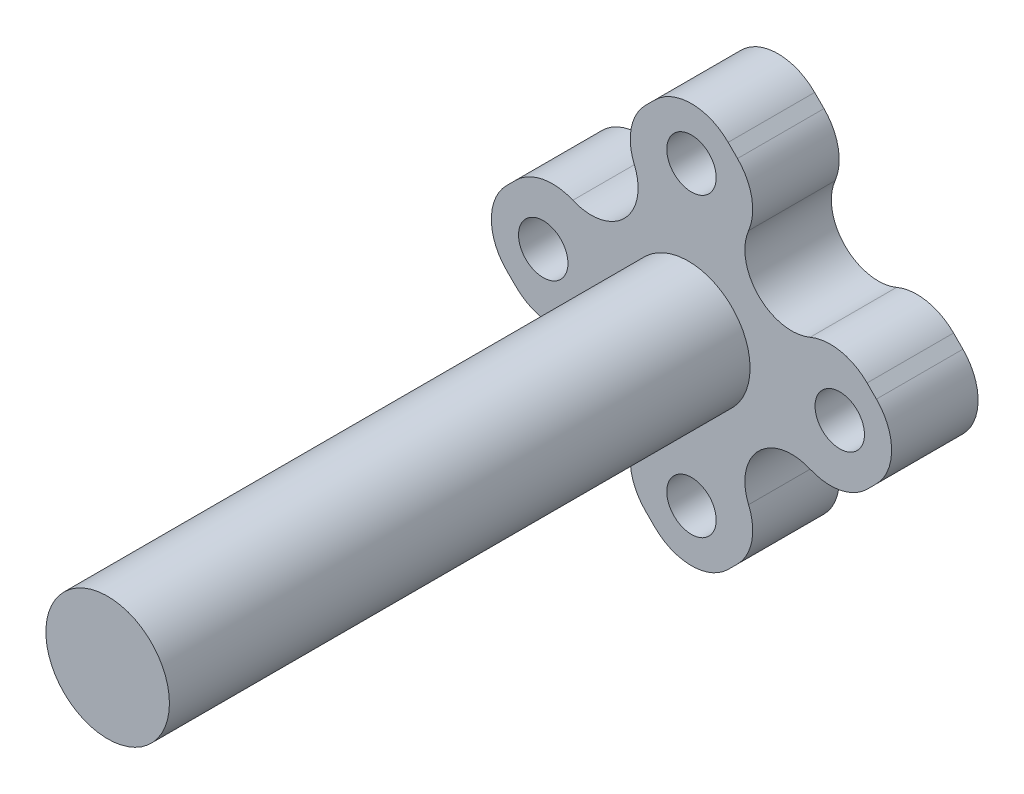
ISO-10303-21;
HEADER;
FILE_DESCRIPTION(('STEP AP214'),'2;1');
FILE_NAME('part.step','',(''),(''),'','','');
FILE_SCHEMA(('AUTOMOTIVE_DESIGN { 1 0 10303 214 1 1 1 1 }'));
ENDSEC;
DATA;
#1=APPLICATION_CONTEXT('core data for automotive mechanical design processes');
#2=APPLICATION_PROTOCOL_DEFINITION('international standard','automotive_design',2000,#1);
#3=PRODUCT_CONTEXT('',#1,'mechanical');
#4=PRODUCT('Part','Part','',(#3));
#5=PRODUCT_RELATED_PRODUCT_CATEGORY('part','',(#4));
#6=PRODUCT_DEFINITION_FORMATION('','',#4);
#7=PRODUCT_DEFINITION_CONTEXT('part definition',#1,'design');
#8=PRODUCT_DEFINITION('design','',#6,#7);
#9=PRODUCT_DEFINITION_SHAPE('','',#8);
#10=(LENGTH_UNIT() NAMED_UNIT(*) SI_UNIT(.MILLI.,.METRE.));
#11=(NAMED_UNIT(*) PLANE_ANGLE_UNIT() SI_UNIT($,.RADIAN.));
#12=(NAMED_UNIT(*) SI_UNIT($,.STERADIAN.) SOLID_ANGLE_UNIT());
#13=UNCERTAINTY_MEASURE_WITH_UNIT(LENGTH_MEASURE(1.E-05),#10,'distance_accuracy_value','');
#14=(GEOMETRIC_REPRESENTATION_CONTEXT(3) GLOBAL_UNCERTAINTY_ASSIGNED_CONTEXT((#13)) GLOBAL_UNIT_ASSIGNED_CONTEXT((#10,
#11,#12)) REPRESENTATION_CONTEXT('',''));
#15=CARTESIAN_POINT('',(0.,0.,0.));
#16=DIRECTION('',(0.,0.,1.));
#17=DIRECTION('',(1.,0.,0.));
#18=AXIS2_PLACEMENT_3D('',#15,#16,#17);
#19=CARTESIAN_POINT('',(0.128862133868904,5.9822875542488,3.5));
#20=DIRECTION('',(0.,0.,1.));
#21=DIRECTION('',(1.,0.,0.));
#22=AXIS2_PLACEMENT_3D('',#19,#20,#21);
#23=PLANE('',#22);
#24=CARTESIAN_POINT('',(0.,0.,3.5));
#25=DIRECTION('',(0.,0.,1.));
#26=DIRECTION('',(1.,0.,0.));
#27=AXIS2_PLACEMENT_3D('',#24,#25,#26);
#28=CIRCLE('',#27,2.5);
#29=CARTESIAN_POINT('',(2.5,0.,3.5));
#30=VERTEX_POINT('',#29);
#31=EDGE_CURVE('E526',#30,#30,#28,.T.);
#32=ORIENTED_EDGE('',*,*,#31,.F.);
#33=EDGE_LOOP('',(#32));
#34=FACE_BOUND('',#33,.T.);
#35=CARTESIAN_POINT('',(6.12886213386876,-0.0177124457511613,3.5));
#36=DIRECTION('',(0.,0.,1.));
#37=DIRECTION('',(1.,0.,0.));
#38=AXIS2_PLACEMENT_3D('',#35,#36,#37);
#39=CIRCLE('',#38,0.99999999999999);
#40=CARTESIAN_POINT('',(7.12886213386875,-0.0177124457511613,3.5));
#41=VERTEX_POINT('',#40);
#42=EDGE_CURVE('E540',#41,#41,#39,.T.);
#43=ORIENTED_EDGE('',*,*,#42,.F.);
#44=EDGE_LOOP('',(#43));
#45=FACE_BOUND('',#44,.T.);
#46=CARTESIAN_POINT('',(0.128862133868531,5.98228755424907,3.5));
#47=DIRECTION('',(0.,0.,1.));
#48=DIRECTION('',(1.,0.,0.));
#49=AXIS2_PLACEMENT_3D('',#46,#47,#48);
#50=CIRCLE('',#49,0.99999999999993);
#51=CARTESIAN_POINT('',(1.12886213386846,5.98228755424907,3.5));
#52=VERTEX_POINT('',#51);
#53=EDGE_CURVE('E242',#52,#52,#50,.T.);
#54=ORIENTED_EDGE('',*,*,#53,.F.);
#55=EDGE_LOOP('',(#54));
#56=FACE_BOUND('',#55,.T.);
#57=CARTESIAN_POINT('',(0.128862133868904,5.9822875542488,3.5));
#58=DIRECTION('',(0.,0.,1.));
#59=DIRECTION('',(1.,0.,0.));
#60=AXIS2_PLACEMENT_3D('',#57,#58,#59);
#61=CIRCLE('',#60,2.10000000000017);
#62=CARTESIAN_POINT('',(1.61378637436093,7.46721179474051,3.5));
#63=VERTEX_POINT('',#62);
#64=CARTESIAN_POINT('',(-1.35606210662298,7.46721179474065,3.5));
#65=VERTEX_POINT('',#64);
#66=EDGE_CURVE('E312',#63,#65,#61,.T.);
#67=ORIENTED_EDGE('',*,*,#66,.T.);
#68=DIRECTION('',(-0.707106781186547,-0.707106781186548,0.));
#69=VECTOR('',#68,1.);
#70=CARTESIAN_POINT('',(-1.73403998619732,7.08923391516631,3.5));
#71=LINE('',#70,#69);
#72=CARTESIAN_POINT('',(-1.73403998619732,7.08923391516631,3.5));
#73=VERTEX_POINT('',#72);
#74=EDGE_CURVE('E147',#65,#73,#71,.T.);
#75=ORIENTED_EDGE('',*,*,#74,.T.);
#76=CARTESIAN_POINT('',(-0.249115745705739,5.60430967467439,3.5));
#77=DIRECTION('',(0.,0.,1.));
#78=DIRECTION('',(1.,0.,0.));
#79=AXIS2_PLACEMENT_3D('',#76,#77,#78);
#80=CIRCLE('',#79,2.1);
#81=CARTESIAN_POINT('',(-2.18252394911343,4.78459465163537,3.5));
#82=VERTEX_POINT('',#81);
#83=EDGE_CURVE('E397',#73,#82,#80,.T.);
#84=ORIENTED_EDGE('',*,*,#83,.T.);
#85=CARTESIAN_POINT('',(-3.93179803791084,4.0429477260283,3.5));
#86=DIRECTION('',(0.,0.,-1.));
#87=DIRECTION('',(1.,0.,0.));
#88=AXIS2_PLACEMENT_3D('',#85,#86,#87);
#89=CIRCLE('',#88,1.90000000000012);
#90=CARTESIAN_POINT('',(-4.67344496351814,2.29367363723104,3.5));
#91=VERTEX_POINT('',#90);
#92=EDGE_CURVE('E416',#82,#91,#89,.T.);
#93=ORIENTED_EDGE('',*,*,#92,.T.);
#94=CARTESIAN_POINT('',(-5.49315998655736,0.360265433823407,3.5));
#95=DIRECTION('',(0.,0.,1.));
#96=DIRECTION('',(1.,0.,0.));
#97=AXIS2_PLACEMENT_3D('',#94,#95,#96);
#98=CIRCLE('',#97,2.10000000000002);
#99=CARTESIAN_POINT('',(-6.97808422704921,1.84518967431506,3.5));
#100=VERTEX_POINT('',#99);
#101=EDGE_CURVE('E412',#91,#100,#98,.T.);
#102=ORIENTED_EDGE('',*,*,#101,.T.);
#103=DIRECTION('',(-0.70710678118655,-0.707106781186545,0.));
#104=VECTOR('',#103,1.);
#105=CARTESIAN_POINT('',(-7.35606210662355,1.46721179474072,3.5));
#106=LINE('',#105,#104);
#107=CARTESIAN_POINT('',(-7.35606210662355,1.46721179474072,3.5));
#108=VERTEX_POINT('',#107);
#109=EDGE_CURVE('E415',#100,#108,#106,.T.);
#110=ORIENTED_EDGE('',*,*,#109,.T.);
#111=CARTESIAN_POINT('',(-5.8711378661317,-0.0177124457511587,3.5));
#112=DIRECTION('',(0.,0.,1.));
#113=DIRECTION('',(1.,0.,0.));
#114=AXIS2_PLACEMENT_3D('',#111,#112,#113);
#115=CIRCLE('',#114,2.10000000000016);
#116=CARTESIAN_POINT('',(-7.35606210662344,-1.50263668624315,3.5));
#117=VERTEX_POINT('',#116);
#118=EDGE_CURVE('E420',#108,#117,#115,.T.);
#119=ORIENTED_EDGE('',*,*,#118,.T.);
#120=DIRECTION('',(0.707106781186545,-0.70710678118655,0.));
#121=VECTOR('',#120,1.);
#122=CARTESIAN_POINT('',(-6.9780842270488,-1.88061456581779,3.5));
#123=LINE('',#122,#121);
#124=CARTESIAN_POINT('',(-6.9780842270488,-1.88061456581779,3.5));
#125=VERTEX_POINT('',#124);
#126=EDGE_CURVE('E427',#117,#125,#123,.T.);
#127=ORIENTED_EDGE('',*,*,#126,.T.);
#128=CARTESIAN_POINT('',(-5.49315998655705,-0.395690325326044,3.5));
#129=DIRECTION('',(0.,0.,1.));
#130=DIRECTION('',(1.,0.,0.));
#131=AXIS2_PLACEMENT_3D('',#128,#129,#130);
#132=CIRCLE('',#131,2.1);
#133=CARTESIAN_POINT('',(-4.67344496351796,-2.3290985287337,3.5));
#134=VERTEX_POINT('',#133);
#135=EDGE_CURVE('E430',#125,#134,#132,.T.);
#136=ORIENTED_EDGE('',*,*,#135,.T.);
#137=CARTESIAN_POINT('',(-3.93179803791116,-4.07837261753111,3.5));
#138=DIRECTION('',(0.,0.,-1.));
#139=DIRECTION('',(1.,0.,0.));
#140=AXIS2_PLACEMENT_3D('',#137,#138,#139);
#141=CIRCLE('',#140,1.9);
#142=CARTESIAN_POINT('',(-2.18252394911376,-4.8200195431379,3.5));
#143=VERTEX_POINT('',#142);
#144=EDGE_CURVE('E433',#134,#143,#141,.T.);
#145=ORIENTED_EDGE('',*,*,#144,.T.);
#146=CARTESIAN_POINT('',(-0.249115745706102,-5.63973456617699,3.5));
#147=DIRECTION('',(0.,0.,1.));
#148=DIRECTION('',(1.,0.,0.));
#149=AXIS2_PLACEMENT_3D('',#146,#147,#148);
#150=CIRCLE('',#149,2.1);
#151=CARTESIAN_POINT('',(-1.73403998619785,-7.12465880666874,3.5));
#152=VERTEX_POINT('',#151);
#153=EDGE_CURVE('E436',#143,#152,#150,.T.);
#154=ORIENTED_EDGE('',*,*,#153,.T.);
#155=DIRECTION('',(0.707106781186542,-0.707106781186553,0.));
#156=VECTOR('',#155,1.);
#157=CARTESIAN_POINT('',(-1.35606210662347,-7.50263668624313,3.5));
#158=LINE('',#157,#156);
#159=CARTESIAN_POINT('',(-1.35606210662347,-7.50263668624313,3.5));
#160=VERTEX_POINT('',#159);
#161=EDGE_CURVE('E439',#152,#160,#158,.T.);
#162=ORIENTED_EDGE('',*,*,#161,.T.);
#163=CARTESIAN_POINT('',(0.128862133868298,-6.0177124457514,3.5));
#164=DIRECTION('',(0.,0.,1.));
#165=DIRECTION('',(1.,0.,0.));
#166=AXIS2_PLACEMENT_3D('',#163,#164,#165);
#167=CIRCLE('',#166,2.1);
#168=CARTESIAN_POINT('',(1.61378637436005,-7.50263668624315,3.5));
#169=VERTEX_POINT('',#168);
#170=EDGE_CURVE('E442',#160,#169,#167,.T.);
#171=ORIENTED_EDGE('',*,*,#170,.T.);
#172=DIRECTION('',(0.707106781186551,0.707106781186544,0.));
#173=VECTOR('',#172,1.);
#174=CARTESIAN_POINT('',(1.99176425393481,-7.12465880666839,3.5));
#175=LINE('',#174,#173);
#176=CARTESIAN_POINT('',(1.99176425393481,-7.12465880666839,3.5));
#177=VERTEX_POINT('',#176);
#178=EDGE_CURVE('E445',#169,#177,#175,.T.);
#179=ORIENTED_EDGE('',*,*,#178,.T.);
#180=CARTESIAN_POINT('',(0.506840013443062,-5.63973456617663,3.5));
#181=DIRECTION('',(0.,0.,1.));
#182=DIRECTION('',(1.,0.,0.));
#183=AXIS2_PLACEMENT_3D('',#180,#181,#182);
#184=CIRCLE('',#183,2.1);
#185=CARTESIAN_POINT('',(2.44024821685072,-4.82001954313754,3.5));
#186=VERTEX_POINT('',#185);
#187=EDGE_CURVE('E448',#177,#186,#184,.T.);
#188=ORIENTED_EDGE('',*,*,#187,.T.);
#189=CARTESIAN_POINT('',(4.18952230564812,-4.07837261753075,3.5));
#190=DIRECTION('',(0.,0.,-1.));
#191=DIRECTION('',(1.,0.,0.));
#192=AXIS2_PLACEMENT_3D('',#189,#190,#191);
#193=CIRCLE('',#192,1.9);
#194=CARTESIAN_POINT('',(4.93116923125491,-2.32909852873334,3.5));
#195=VERTEX_POINT('',#194);
#196=EDGE_CURVE('E451',#186,#195,#193,.T.);
#197=ORIENTED_EDGE('',*,*,#196,.T.);
#198=CARTESIAN_POINT('',(5.75088425429401,-0.395690325325688,3.5));
#199=DIRECTION('',(0.,0.,1.));
#200=DIRECTION('',(1.,0.,0.));
#201=AXIS2_PLACEMENT_3D('',#198,#199,#200);
#202=CIRCLE('',#201,2.1);
#203=CARTESIAN_POINT('',(7.23580849478576,-1.88061456581744,3.5));
#204=VERTEX_POINT('',#203);
#205=EDGE_CURVE('E454',#195,#204,#202,.T.);
#206=ORIENTED_EDGE('',*,*,#205,.T.);
#207=DIRECTION('',(0.707106781186549,0.707106781186546,0.));
#208=VECTOR('',#207,1.);
#209=CARTESIAN_POINT('',(7.61378637436052,-1.50263668624268,3.5));
#210=LINE('',#209,#208);
#211=CARTESIAN_POINT('',(7.61378637436052,-1.50263668624268,3.5));
#212=VERTEX_POINT('',#211);
#213=EDGE_CURVE('E457',#204,#212,#210,.T.);
#214=ORIENTED_EDGE('',*,*,#213,.T.);
#215=CARTESIAN_POINT('',(6.12886213386918,-0.0177124457505208,3.5));
#216=DIRECTION('',(0.,0.,1.));
#217=DIRECTION('',(1.,0.,0.));
#218=AXIS2_PLACEMENT_3D('',#215,#216,#217);
#219=CIRCLE('',#218,2.1);
#220=CARTESIAN_POINT('',(7.61378637436092,1.46721179474053,3.5));
#221=VERTEX_POINT('',#220);
#222=EDGE_CURVE('E460',#212,#221,#219,.T.);
#223=ORIENTED_EDGE('',*,*,#222,.T.);
#224=DIRECTION('',(-0.707106781186548,0.707106781186547,0.));
#225=VECTOR('',#224,1.);
#226=CARTESIAN_POINT('',(7.23580849478653,1.84518967431492,3.5));
#227=LINE('',#226,#225);
#228=CARTESIAN_POINT('',(7.23580849478653,1.84518967431492,3.5));
#229=VERTEX_POINT('',#228);
#230=EDGE_CURVE('E463',#221,#229,#227,.T.);
#231=ORIENTED_EDGE('',*,*,#230,.T.);
#232=CARTESIAN_POINT('',(5.75088425429478,0.360265433823168,3.5));
#233=DIRECTION('',(0.,0.,1.));
#234=DIRECTION('',(1.,0.,0.));
#235=AXIS2_PLACEMENT_3D('',#232,#233,#234);
#236=CIRCLE('',#235,2.1);
#237=CARTESIAN_POINT('',(4.93116923125569,2.29367363723082,3.5));
#238=VERTEX_POINT('',#237);
#239=EDGE_CURVE('E214',#229,#238,#236,.T.);
#240=ORIENTED_EDGE('',*,*,#239,.T.);
#241=CARTESIAN_POINT('',(4.18952230564889,4.04294772602823,3.5));
#242=DIRECTION('',(0.,0.,-1.));
#243=DIRECTION('',(1.,0.,0.));
#244=AXIS2_PLACEMENT_3D('',#241,#242,#243);
#245=CIRCLE('',#244,1.9);
#246=CARTESIAN_POINT('',(2.44024821685149,4.78459465163502,3.5));
#247=VERTEX_POINT('',#246);
#248=EDGE_CURVE('E208',#238,#247,#245,.T.);
#249=ORIENTED_EDGE('',*,*,#248,.T.);
#250=CARTESIAN_POINT('',(0.506840013443829,5.60430967467411,3.5));
#251=DIRECTION('',(0.,0.,1.));
#252=DIRECTION('',(1.,0.,0.));
#253=AXIS2_PLACEMENT_3D('',#250,#251,#252);
#254=CIRCLE('',#253,2.1);
#255=CARTESIAN_POINT('',(1.99176425393558,7.08923391516586,3.5));
#256=VERTEX_POINT('',#255);
#257=EDGE_CURVE('E212',#247,#256,#254,.T.);
#258=ORIENTED_EDGE('',*,*,#257,.T.);
#259=DIRECTION('',(-0.707106781186548,0.707106781186547,0.));
#260=VECTOR('',#259,1.);
#261=CARTESIAN_POINT('',(1.61378637436093,7.46721179474051,3.5));
#262=LINE('',#261,#260);
#263=EDGE_CURVE('E57',#256,#63,#262,.T.);
#264=ORIENTED_EDGE('',*,*,#263,.T.);
#265=EDGE_LOOP('',(#67,#75,#84,#93,#102,#110,#119,#127,#136,#145,#154,#162,#171,#179,#188,#197,
#206,#214,#223,#231,#240,#249,#258,#264));
#266=FACE_BOUND('',#265,.T.);
#267=CARTESIAN_POINT('',(0.128862133868298,-6.0177124457514,3.5));
#268=DIRECTION('',(0.,0.,1.));
#269=DIRECTION('',(1.,0.,0.));
#270=AXIS2_PLACEMENT_3D('',#267,#268,#269);
#271=CIRCLE('',#270,0.999999999999785);
#272=CARTESIAN_POINT('',(1.12886213386808,-6.0177124457514,3.5));
#273=VERTEX_POINT('',#272);
#274=EDGE_CURVE('E548',#273,#273,#271,.T.);
#275=ORIENTED_EDGE('',*,*,#274,.F.);
#276=EDGE_LOOP('',(#275));
#277=FACE_BOUND('',#276,.T.);
#278=CARTESIAN_POINT('',(-5.8711378661317,-0.0177124457511587,3.5));
#279=DIRECTION('',(0.,0.,1.));
#280=DIRECTION('',(1.,0.,0.));
#281=AXIS2_PLACEMENT_3D('',#278,#279,#280);
#282=CIRCLE('',#281,0.99999999999995);
#283=CARTESIAN_POINT('',(-4.87113786613175,-0.0177124457511587,3.5));
#284=VERTEX_POINT('',#283);
#285=EDGE_CURVE('E531',#284,#284,#282,.T.);
#286=ORIENTED_EDGE('',*,*,#285,.F.);
#287=EDGE_LOOP('',(#286));
#288=FACE_BOUND('',#287,.T.);
#289=ADVANCED_FACE('F39',(#34,#45,#56,#266,#277,#288),#23,.T.);
#290=CARTESIAN_POINT('',(0.128862133868904,5.9822875542488,0.));
#291=DIRECTION('',(0.,0.,1.));
#292=DIRECTION('',(1.,0.,0.));
#293=AXIS2_PLACEMENT_3D('',#290,#291,#292);
#294=PLANE('',#293);
#295=CARTESIAN_POINT('',(0.128862133868904,5.9822875542488,0.));
#296=DIRECTION('',(0.,0.,1.));
#297=DIRECTION('',(1.,0.,0.));
#298=AXIS2_PLACEMENT_3D('',#295,#296,#297);
#299=CIRCLE('',#298,2.10000000000017);
#300=CARTESIAN_POINT('',(1.61378637436093,7.46721179474051,0.));
#301=VERTEX_POINT('',#300);
#302=CARTESIAN_POINT('',(-1.35606210662298,7.46721179474065,0.));
#303=VERTEX_POINT('',#302);
#304=EDGE_CURVE('E237',#301,#303,#299,.T.);
#305=ORIENTED_EDGE('',*,*,#304,.F.);
#306=DIRECTION('',(-0.707106781186548,0.707106781186547,0.));
#307=VECTOR('',#306,1.);
#308=CARTESIAN_POINT('',(1.61378637436093,7.46721179474051,0.));
#309=LINE('',#308,#307);
#310=CARTESIAN_POINT('',(1.99176425393558,7.08923391516586,0.));
#311=VERTEX_POINT('',#310);
#312=EDGE_CURVE('E139',#311,#301,#309,.T.);
#313=ORIENTED_EDGE('',*,*,#312,.F.);
#314=CARTESIAN_POINT('',(0.506840013443828,5.60430967467411,0.));
#315=DIRECTION('',(0.,0.,1.));
#316=DIRECTION('',(1.,0.,0.));
#317=AXIS2_PLACEMENT_3D('',#314,#315,#316);
#318=CIRCLE('',#317,2.1);
#319=CARTESIAN_POINT('',(2.44024821685149,4.78459465163502,0.));
#320=VERTEX_POINT('',#319);
#321=EDGE_CURVE('E133',#320,#311,#318,.T.);
#322=ORIENTED_EDGE('',*,*,#321,.F.);
#323=CARTESIAN_POINT('',(4.18952230564889,4.04294772602823,0.));
#324=DIRECTION('',(0.,0.,-1.));
#325=DIRECTION('',(1.,0.,0.));
#326=AXIS2_PLACEMENT_3D('',#323,#324,#325);
#327=CIRCLE('',#326,1.9);
#328=CARTESIAN_POINT('',(4.93116923125569,2.29367363723082,0.));
#329=VERTEX_POINT('',#328);
#330=EDGE_CURVE('E224',#329,#320,#327,.T.);
#331=ORIENTED_EDGE('',*,*,#330,.F.);
#332=CARTESIAN_POINT('',(5.75088425429478,0.360265433823168,0.));
#333=DIRECTION('',(0.,0.,1.));
#334=DIRECTION('',(1.,0.,0.));
#335=AXIS2_PLACEMENT_3D('',#332,#333,#334);
#336=CIRCLE('',#335,2.1);
#337=CARTESIAN_POINT('',(7.23580849478653,1.84518967431492,0.));
#338=VERTEX_POINT('',#337);
#339=EDGE_CURVE('E303',#338,#329,#336,.T.);
#340=ORIENTED_EDGE('',*,*,#339,.F.);
#341=DIRECTION('',(-0.707106781186548,0.707106781186547,0.));
#342=VECTOR('',#341,1.);
#343=CARTESIAN_POINT('',(7.23580849478653,1.84518967431492,0.));
#344=LINE('',#343,#342);
#345=CARTESIAN_POINT('',(7.61378637436092,1.46721179474053,0.));
#346=VERTEX_POINT('',#345);
#347=EDGE_CURVE('E300',#346,#338,#344,.T.);
#348=ORIENTED_EDGE('',*,*,#347,.F.);
#349=CARTESIAN_POINT('',(6.12886213386918,-0.0177124457512355,0.));
#350=DIRECTION('',(0.,0.,1.));
#351=DIRECTION('',(1.,0.,0.));
#352=AXIS2_PLACEMENT_3D('',#349,#350,#351);
#353=CIRCLE('',#352,2.1);
#354=CARTESIAN_POINT('',(7.61378637436052,-1.50263668624268,0.));
#355=VERTEX_POINT('',#354);
#356=EDGE_CURVE('E297',#355,#346,#353,.T.);
#357=ORIENTED_EDGE('',*,*,#356,.F.);
#358=DIRECTION('',(0.707106781186549,0.707106781186546,0.));
#359=VECTOR('',#358,1.);
#360=CARTESIAN_POINT('',(7.61378637436052,-1.50263668624268,0.));
#361=LINE('',#360,#359);
#362=CARTESIAN_POINT('',(7.23580849478576,-1.88061456581744,0.));
#363=VERTEX_POINT('',#362);
#364=EDGE_CURVE('E293',#363,#355,#361,.T.);
#365=ORIENTED_EDGE('',*,*,#364,.F.);
#366=CARTESIAN_POINT('',(5.75088425429401,-0.395690325325688,0.));
#367=DIRECTION('',(0.,0.,1.));
#368=DIRECTION('',(1.,0.,0.));
#369=AXIS2_PLACEMENT_3D('',#366,#367,#368);
#370=CIRCLE('',#369,2.1);
#371=CARTESIAN_POINT('',(4.93116923125491,-2.32909852873334,0.));
#372=VERTEX_POINT('',#371);
#373=EDGE_CURVE('E290',#372,#363,#370,.T.);
#374=ORIENTED_EDGE('',*,*,#373,.F.);
#375=CARTESIAN_POINT('',(4.18952230564812,-4.07837261753075,0.));
#376=DIRECTION('',(0.,0.,-1.));
#377=DIRECTION('',(1.,0.,0.));
#378=AXIS2_PLACEMENT_3D('',#375,#376,#377);
#379=CIRCLE('',#378,1.9);
#380=CARTESIAN_POINT('',(2.44024821685072,-4.82001954313754,0.));
#381=VERTEX_POINT('',#380);
#382=EDGE_CURVE('E287',#381,#372,#379,.T.);
#383=ORIENTED_EDGE('',*,*,#382,.F.);
#384=CARTESIAN_POINT('',(0.506840013443062,-5.63973456617663,0.));
#385=DIRECTION('',(0.,0.,1.));
#386=DIRECTION('',(1.,0.,0.));
#387=AXIS2_PLACEMENT_3D('',#384,#385,#386);
#388=CIRCLE('',#387,2.1);
#389=CARTESIAN_POINT('',(1.99176425393481,-7.12465880666839,0.));
#390=VERTEX_POINT('',#389);
#391=EDGE_CURVE('E284',#390,#381,#388,.T.);
#392=ORIENTED_EDGE('',*,*,#391,.F.);
#393=DIRECTION('',(0.707106781186551,0.707106781186544,0.));
#394=VECTOR('',#393,1.);
#395=CARTESIAN_POINT('',(1.99176425393481,-7.12465880666839,0.));
#396=LINE('',#395,#394);
#397=CARTESIAN_POINT('',(1.61378637436005,-7.50263668624315,0.));
#398=VERTEX_POINT('',#397);
#399=EDGE_CURVE('E280',#398,#390,#396,.T.);
#400=ORIENTED_EDGE('',*,*,#399,.F.);
#401=CARTESIAN_POINT('',(0.128862133868298,-6.0177124457514,0.));
#402=DIRECTION('',(0.,0.,1.));
#403=DIRECTION('',(1.,0.,0.));
#404=AXIS2_PLACEMENT_3D('',#401,#402,#403);
#405=CIRCLE('',#404,2.1);
#406=CARTESIAN_POINT('',(-1.35606210662347,-7.50263668624313,0.));
#407=VERTEX_POINT('',#406);
#408=EDGE_CURVE('E277',#407,#398,#405,.T.);
#409=ORIENTED_EDGE('',*,*,#408,.F.);
#410=DIRECTION('',(0.707106781186542,-0.707106781186553,0.));
#411=VECTOR('',#410,1.);
#412=CARTESIAN_POINT('',(-1.35606210662347,-7.50263668624313,0.));
#413=LINE('',#412,#411);
#414=CARTESIAN_POINT('',(-1.73403998619785,-7.12465880666874,0.));
#415=VERTEX_POINT('',#414);
#416=EDGE_CURVE('E274',#415,#407,#413,.T.);
#417=ORIENTED_EDGE('',*,*,#416,.F.);
#418=CARTESIAN_POINT('',(-0.249115745706102,-5.63973456617699,0.));
#419=DIRECTION('',(0.,0.,1.));
#420=DIRECTION('',(1.,0.,0.));
#421=AXIS2_PLACEMENT_3D('',#418,#419,#420);
#422=CIRCLE('',#421,2.1);
#423=CARTESIAN_POINT('',(-2.18252394911376,-4.8200195431379,0.));
#424=VERTEX_POINT('',#423);
#425=EDGE_CURVE('E271',#424,#415,#422,.T.);
#426=ORIENTED_EDGE('',*,*,#425,.F.);
#427=CARTESIAN_POINT('',(-3.93179803791116,-4.07837261753111,0.));
#428=DIRECTION('',(0.,0.,-1.));
#429=DIRECTION('',(1.,0.,0.));
#430=AXIS2_PLACEMENT_3D('',#427,#428,#429);
#431=CIRCLE('',#430,1.9);
#432=CARTESIAN_POINT('',(-4.67344496351796,-2.3290985287337,0.));
#433=VERTEX_POINT('',#432);
#434=EDGE_CURVE('E268',#433,#424,#431,.T.);
#435=ORIENTED_EDGE('',*,*,#434,.F.);
#436=CARTESIAN_POINT('',(-5.49315998655705,-0.395690325326044,0.));
#437=DIRECTION('',(0.,0.,1.));
#438=DIRECTION('',(1.,0.,0.));
#439=AXIS2_PLACEMENT_3D('',#436,#437,#438);
#440=CIRCLE('',#439,2.1);
#441=CARTESIAN_POINT('',(-6.9780842270488,-1.88061456581779,0.));
#442=VERTEX_POINT('',#441);
#443=EDGE_CURVE('E264',#442,#433,#440,.T.);
#444=ORIENTED_EDGE('',*,*,#443,.F.);
#445=DIRECTION('',(0.707106781186545,-0.70710678118655,0.));
#446=VECTOR('',#445,1.);
#447=CARTESIAN_POINT('',(-6.9780842270488,-1.88061456581779,0.));
#448=LINE('',#447,#446);
#449=CARTESIAN_POINT('',(-7.35606210662344,-1.50263668624315,0.));
#450=VERTEX_POINT('',#449);
#451=EDGE_CURVE('E261',#450,#442,#448,.T.);
#452=ORIENTED_EDGE('',*,*,#451,.F.);
#453=CARTESIAN_POINT('',(-5.8711378661317,-0.0177124457511587,0.));
#454=DIRECTION('',(0.,0.,1.));
#455=DIRECTION('',(1.,0.,0.));
#456=AXIS2_PLACEMENT_3D('',#453,#454,#455);
#457=CIRCLE('',#456,2.10000000000016);
#458=CARTESIAN_POINT('',(-7.35606210662355,1.46721179474072,0.));
#459=VERTEX_POINT('',#458);
#460=EDGE_CURVE('E258',#459,#450,#457,.T.);
#461=ORIENTED_EDGE('',*,*,#460,.F.);
#462=DIRECTION('',(-0.70710678118655,-0.707106781186545,0.));
#463=VECTOR('',#462,1.);
#464=CARTESIAN_POINT('',(-7.35606210662355,1.46721179474072,0.));
#465=LINE('',#464,#463);
#466=CARTESIAN_POINT('',(-6.97808422704921,1.84518967431506,0.));
#467=VERTEX_POINT('',#466);
#468=EDGE_CURVE('E255',#467,#459,#465,.T.);
#469=ORIENTED_EDGE('',*,*,#468,.F.);
#470=CARTESIAN_POINT('',(-5.49315998655736,0.360265433823407,0.));
#471=DIRECTION('',(0.,0.,1.));
#472=DIRECTION('',(1.,0.,0.));
#473=AXIS2_PLACEMENT_3D('',#470,#471,#472);
#474=CIRCLE('',#473,2.10000000000002);
#475=CARTESIAN_POINT('',(-4.67344496351814,2.29367363723104,0.));
#476=VERTEX_POINT('',#475);
#477=EDGE_CURVE('E252',#476,#467,#474,.T.);
#478=ORIENTED_EDGE('',*,*,#477,.F.);
#479=CARTESIAN_POINT('',(-3.93179803791091,4.04294772602849,0.));
#480=DIRECTION('',(0.,0.,-1.));
#481=DIRECTION('',(1.,0.,0.));
#482=AXIS2_PLACEMENT_3D('',#479,#480,#481);
#483=CIRCLE('',#482,1.90000000000019);
#484=CARTESIAN_POINT('',(-2.18252394911343,4.78459465163537,0.));
#485=VERTEX_POINT('',#484);
#486=EDGE_CURVE('E249',#485,#476,#483,.T.);
#487=ORIENTED_EDGE('',*,*,#486,.F.);
#488=CARTESIAN_POINT('',(-0.249115745705739,5.60430967467439,0.));
#489=DIRECTION('',(0.,0.,1.));
#490=DIRECTION('',(1.,0.,0.));
#491=AXIS2_PLACEMENT_3D('',#488,#489,#490);
#492=CIRCLE('',#491,2.1);
#493=CARTESIAN_POINT('',(-1.73403998619732,7.08923391516631,0.));
#494=VERTEX_POINT('',#493);
#495=EDGE_CURVE('E245',#494,#485,#492,.T.);
#496=ORIENTED_EDGE('',*,*,#495,.F.);
#497=DIRECTION('',(-0.707106781186547,-0.707106781186548,0.));
#498=VECTOR('',#497,1.);
#499=CARTESIAN_POINT('',(-1.73403998619732,7.08923391516631,0.));
#500=LINE('',#499,#498);
#501=EDGE_CURVE('E241',#303,#494,#500,.T.);
#502=ORIENTED_EDGE('',*,*,#501,.F.);
#503=EDGE_LOOP('',(#305,#313,#322,#331,#340,#348,#357,#365,#374,#383,#392,#400,#409,#417,#426,
#435,#444,#452,#461,#469,#478,#487,#496,#502));
#504=FACE_BOUND('',#503,.T.);
#505=CARTESIAN_POINT('',(0.128862133868531,5.98228755424907,0.));
#506=DIRECTION('',(0.,0.,1.));
#507=DIRECTION('',(1.,0.,0.));
#508=AXIS2_PLACEMENT_3D('',#505,#506,#507);
#509=CIRCLE('',#508,0.99999999999993);
#510=CARTESIAN_POINT('',(1.12886213386846,5.98228755424907,0.));
#511=VERTEX_POINT('',#510);
#512=EDGE_CURVE('E552',#511,#511,#509,.T.);
#513=ORIENTED_EDGE('',*,*,#512,.T.);
#514=EDGE_LOOP('',(#513));
#515=FACE_BOUND('',#514,.T.);
#516=CARTESIAN_POINT('',(0.128862133868298,-6.0177124457514,0.));
#517=DIRECTION('',(0.,0.,1.));
#518=DIRECTION('',(1.,0.,0.));
#519=AXIS2_PLACEMENT_3D('',#516,#517,#518);
#520=CIRCLE('',#519,0.999999999999785);
#521=CARTESIAN_POINT('',(1.12886213386808,-6.0177124457514,0.));
#522=VERTEX_POINT('',#521);
#523=EDGE_CURVE('E544',#522,#522,#520,.T.);
#524=ORIENTED_EDGE('',*,*,#523,.T.);
#525=EDGE_LOOP('',(#524));
#526=FACE_BOUND('',#525,.T.);
#527=CARTESIAN_POINT('',(6.12886213386876,-0.0177124457511613,0.));
#528=DIRECTION('',(0.,0.,1.));
#529=DIRECTION('',(1.,0.,0.));
#530=AXIS2_PLACEMENT_3D('',#527,#528,#529);
#531=CIRCLE('',#530,0.99999999999999);
#532=CARTESIAN_POINT('',(7.12886213386875,-0.0177124457511613,0.));
#533=VERTEX_POINT('',#532);
#534=EDGE_CURVE('E538',#533,#533,#531,.T.);
#535=ORIENTED_EDGE('',*,*,#534,.T.);
#536=EDGE_LOOP('',(#535));
#537=FACE_BOUND('',#536,.T.);
#538=CARTESIAN_POINT('',(-5.8711378661317,-0.0177124457511587,0.));
#539=DIRECTION('',(0.,0.,1.));
#540=DIRECTION('',(1.,0.,0.));
#541=AXIS2_PLACEMENT_3D('',#538,#539,#540);
#542=CIRCLE('',#541,0.99999999999995);
#543=CARTESIAN_POINT('',(-4.87113786613175,-0.0177124457511587,0.));
#544=VERTEX_POINT('',#543);
#545=EDGE_CURVE('E525',#544,#544,#542,.T.);
#546=ORIENTED_EDGE('',*,*,#545,.T.);
#547=EDGE_LOOP('',(#546));
#548=FACE_BOUND('',#547,.T.);
#549=ADVANCED_FACE('F400',(#504,#515,#526,#537,#548),#294,.F.);
#550=CARTESIAN_POINT('',(0.128862133868904,5.9822875542488,3.5));
#551=DIRECTION('',(0.,0.,-1.));
#552=DIRECTION('',(-1.,0.,0.));
#553=AXIS2_PLACEMENT_3D('',#550,#551,#552);
#554=CYLINDRICAL_SURFACE('',#553,2.10000000000017);
#555=ORIENTED_EDGE('',*,*,#304,.T.);
#556=DIRECTION('',(0.,0.,-1.));
#557=VECTOR('',#556,1.);
#558=CARTESIAN_POINT('',(-1.35606210662298,7.46721179474065,3.5));
#559=LINE('',#558,#557);
#560=EDGE_CURVE('E11',#65,#303,#559,.T.);
#561=ORIENTED_EDGE('',*,*,#560,.F.);
#562=ORIENTED_EDGE('',*,*,#66,.F.);
#563=DIRECTION('',(0.,0.,-1.));
#564=VECTOR('',#563,1.);
#565=CARTESIAN_POINT('',(1.61378637436093,7.46721179474051,3.5));
#566=LINE('',#565,#564);
#567=EDGE_CURVE('E233',#63,#301,#566,.T.);
#568=ORIENTED_EDGE('',*,*,#567,.T.);
#569=EDGE_LOOP('',(#555,#561,#562,#568));
#570=FACE_BOUND('',#569,.T.);
#571=ADVANCED_FACE('F41',(#570),#554,.T.);
#572=CARTESIAN_POINT('',(-1.73403998619732,7.08923391516631,3.5));
#573=DIRECTION('',(0.707106781186548,-0.707106781186547,0.));
#574=DIRECTION('',(0.707106781186547,0.707106781186548,0.));
#575=AXIS2_PLACEMENT_3D('',#572,#573,#574);
#576=PLANE('',#575);
#577=ORIENTED_EDGE('',*,*,#501,.T.);
#578=DIRECTION('',(0.,0.,-1.));
#579=VECTOR('',#578,1.);
#580=CARTESIAN_POINT('',(-1.73403998619732,7.08923391516631,3.5));
#581=LINE('',#580,#579);
#582=EDGE_CURVE('E49',#73,#494,#581,.T.);
#583=ORIENTED_EDGE('',*,*,#582,.F.);
#584=ORIENTED_EDGE('',*,*,#74,.F.);
#585=ORIENTED_EDGE('',*,*,#560,.T.);
#586=EDGE_LOOP('',(#577,#583,#584,#585));
#587=FACE_BOUND('',#586,.T.);
#588=ADVANCED_FACE('F810',(#587),#576,.F.);
#589=CARTESIAN_POINT('',(-0.249115745705739,5.60430967467439,3.5));
#590=DIRECTION('',(0.,0.,-1.));
#591=DIRECTION('',(-1.,0.,0.));
#592=AXIS2_PLACEMENT_3D('',#589,#590,#591);
#593=CYLINDRICAL_SURFACE('',#592,2.1);
#594=ORIENTED_EDGE('',*,*,#495,.T.);
#595=DIRECTION('',(0.,0.,-1.));
#596=VECTOR('',#595,1.);
#597=CARTESIAN_POINT('',(-2.18252394911343,4.78459465163537,3.5));
#598=LINE('',#597,#596);
#599=EDGE_CURVE('E387',#82,#485,#598,.T.);
#600=ORIENTED_EDGE('',*,*,#599,.F.);
#601=ORIENTED_EDGE('',*,*,#83,.F.);
#602=ORIENTED_EDGE('',*,*,#582,.T.);
#603=EDGE_LOOP('',(#594,#600,#601,#602));
#604=FACE_BOUND('',#603,.T.);
#605=ADVANCED_FACE('F395',(#604),#593,.T.);
#606=CARTESIAN_POINT('',(-3.93179803791091,4.04294772602849,3.5));
#607=DIRECTION('',(0.,0.,-1.));
#608=DIRECTION('',(-1.,0.,0.));
#609=AXIS2_PLACEMENT_3D('',#606,#607,#608);
#610=CYLINDRICAL_SURFACE('',#609,1.90000000000019);
#611=ORIENTED_EDGE('',*,*,#486,.T.);
#612=DIRECTION('',(0.,0.,-1.));
#613=VECTOR('',#612,1.);
#614=CARTESIAN_POINT('',(-4.67344496351814,2.29367363723104,3.5));
#615=LINE('',#614,#613);
#616=EDGE_CURVE('E383',#91,#476,#615,.T.);
#617=ORIENTED_EDGE('',*,*,#616,.F.);
#618=ORIENTED_EDGE('',*,*,#92,.F.);
#619=ORIENTED_EDGE('',*,*,#599,.T.);
#620=EDGE_LOOP('',(#611,#617,#618,#619));
#621=FACE_BOUND('',#620,.T.);
#622=ADVANCED_FACE('F406',(#621),#610,.F.);
#623=CARTESIAN_POINT('',(-5.49315998655736,0.360265433823407,3.5));
#624=DIRECTION('',(0.,0.,-1.));
#625=DIRECTION('',(-1.,0.,0.));
#626=AXIS2_PLACEMENT_3D('',#623,#624,#625);
#627=CYLINDRICAL_SURFACE('',#626,2.10000000000002);
#628=ORIENTED_EDGE('',*,*,#477,.T.);
#629=DIRECTION('',(0.,0.,-1.));
#630=VECTOR('',#629,1.);
#631=CARTESIAN_POINT('',(-6.97808422704921,1.84518967431506,3.5));
#632=LINE('',#631,#630);
#633=EDGE_CURVE('E379',#100,#467,#632,.T.);
#634=ORIENTED_EDGE('',*,*,#633,.F.);
#635=ORIENTED_EDGE('',*,*,#101,.F.);
#636=ORIENTED_EDGE('',*,*,#616,.T.);
#637=EDGE_LOOP('',(#628,#634,#635,#636));
#638=FACE_BOUND('',#637,.T.);
#639=ADVANCED_FACE('F410',(#638),#627,.T.);
#640=CARTESIAN_POINT('',(-7.35606210662355,1.46721179474072,3.5));
#641=DIRECTION('',(0.707106781186545,-0.70710678118655,0.));
#642=DIRECTION('',(0.70710678118655,0.707106781186545,0.));
#643=AXIS2_PLACEMENT_3D('',#640,#641,#642);
#644=PLANE('',#643);
#645=ORIENTED_EDGE('',*,*,#468,.T.);
#646=DIRECTION('',(0.,0.,-1.));
#647=VECTOR('',#646,1.);
#648=CARTESIAN_POINT('',(-7.35606210662355,1.46721179474072,3.5));
#649=LINE('',#648,#647);
#650=EDGE_CURVE('E375',#108,#459,#649,.T.);
#651=ORIENTED_EDGE('',*,*,#650,.F.);
#652=ORIENTED_EDGE('',*,*,#109,.F.);
#653=ORIENTED_EDGE('',*,*,#633,.T.);
#654=EDGE_LOOP('',(#645,#651,#652,#653));
#655=FACE_BOUND('',#654,.T.);
#656=ADVANCED_FACE('F774',(#655),#644,.F.);
#657=CARTESIAN_POINT('',(-5.8711378661317,-0.0177124457511587,3.5));
#658=DIRECTION('',(0.,0.,-1.));
#659=DIRECTION('',(-1.,0.,0.));
#660=AXIS2_PLACEMENT_3D('',#657,#658,#659);
#661=CYLINDRICAL_SURFACE('',#660,2.10000000000016);
#662=ORIENTED_EDGE('',*,*,#460,.T.);
#663=DIRECTION('',(0.,0.,-1.));
#664=VECTOR('',#663,1.);
#665=CARTESIAN_POINT('',(-7.35606210662344,-1.50263668624315,3.5));
#666=LINE('',#665,#664);
#667=EDGE_CURVE('E371',#117,#450,#666,.T.);
#668=ORIENTED_EDGE('',*,*,#667,.F.);
#669=ORIENTED_EDGE('',*,*,#118,.F.);
#670=ORIENTED_EDGE('',*,*,#650,.T.);
#671=EDGE_LOOP('',(#662,#668,#669,#670));
#672=FACE_BOUND('',#671,.T.);
#673=ADVANCED_FACE('F764',(#672),#661,.T.);
#674=CARTESIAN_POINT('',(-6.9780842270488,-1.88061456581779,3.5));
#675=DIRECTION('',(0.70710678118655,0.707106781186545,0.));
#676=DIRECTION('',(-0.707106781186545,0.70710678118655,0.));
#677=AXIS2_PLACEMENT_3D('',#674,#675,#676);
#678=PLANE('',#677);
#679=ORIENTED_EDGE('',*,*,#451,.T.);
#680=DIRECTION('',(0.,0.,-1.));
#681=VECTOR('',#680,1.);
#682=CARTESIAN_POINT('',(-6.9780842270488,-1.88061456581779,3.5));
#683=LINE('',#682,#681);
#684=EDGE_CURVE('E367',#125,#442,#683,.T.);
#685=ORIENTED_EDGE('',*,*,#684,.F.);
#686=ORIENTED_EDGE('',*,*,#126,.F.);
#687=ORIENTED_EDGE('',*,*,#667,.T.);
#688=EDGE_LOOP('',(#679,#685,#686,#687));
#689=FACE_BOUND('',#688,.T.);
#690=ADVANCED_FACE('F754',(#689),#678,.F.);
#691=CARTESIAN_POINT('',(-5.49315998655705,-0.395690325326044,3.5));
#692=DIRECTION('',(0.,0.,-1.));
#693=DIRECTION('',(-1.,0.,0.));
#694=AXIS2_PLACEMENT_3D('',#691,#692,#693);
#695=CYLINDRICAL_SURFACE('',#694,2.1);
#696=ORIENTED_EDGE('',*,*,#443,.T.);
#697=DIRECTION('',(0.,0.,-1.));
#698=VECTOR('',#697,1.);
#699=CARTESIAN_POINT('',(-4.67344496351796,-2.3290985287337,3.5));
#700=LINE('',#699,#698);
#701=EDGE_CURVE('E363',#134,#433,#700,.T.);
#702=ORIENTED_EDGE('',*,*,#701,.F.);
#703=ORIENTED_EDGE('',*,*,#135,.F.);
#704=ORIENTED_EDGE('',*,*,#684,.T.);
#705=EDGE_LOOP('',(#696,#702,#703,#704));
#706=FACE_BOUND('',#705,.T.);
#707=ADVANCED_FACE('F743',(#706),#695,.T.);
#708=CARTESIAN_POINT('',(-3.93179803791116,-4.07837261753111,3.5));
#709=DIRECTION('',(0.,0.,-1.));
#710=DIRECTION('',(-1.,0.,0.));
#711=AXIS2_PLACEMENT_3D('',#708,#709,#710);
#712=CYLINDRICAL_SURFACE('',#711,1.9);
#713=ORIENTED_EDGE('',*,*,#434,.T.);
#714=DIRECTION('',(0.,0.,-1.));
#715=VECTOR('',#714,1.);
#716=CARTESIAN_POINT('',(-2.18252394911376,-4.8200195431379,3.5));
#717=LINE('',#716,#715);
#718=EDGE_CURVE('E359',#143,#424,#717,.T.);
#719=ORIENTED_EDGE('',*,*,#718,.F.);
#720=ORIENTED_EDGE('',*,*,#144,.F.);
#721=ORIENTED_EDGE('',*,*,#701,.T.);
#722=EDGE_LOOP('',(#713,#719,#720,#721));
#723=FACE_BOUND('',#722,.T.);
#724=ADVANCED_FACE('F733',(#723),#712,.F.);
#725=CARTESIAN_POINT('',(-0.249115745706102,-5.63973456617699,3.5));
#726=DIRECTION('',(0.,0.,-1.));
#727=DIRECTION('',(-1.,0.,0.));
#728=AXIS2_PLACEMENT_3D('',#725,#726,#727);
#729=CYLINDRICAL_SURFACE('',#728,2.1);
#730=ORIENTED_EDGE('',*,*,#425,.T.);
#731=DIRECTION('',(0.,0.,-1.));
#732=VECTOR('',#731,1.);
#733=CARTESIAN_POINT('',(-1.73403998619785,-7.12465880666874,3.5));
#734=LINE('',#733,#732);
#735=EDGE_CURVE('E355',#152,#415,#734,.T.);
#736=ORIENTED_EDGE('',*,*,#735,.F.);
#737=ORIENTED_EDGE('',*,*,#153,.F.);
#738=ORIENTED_EDGE('',*,*,#718,.T.);
#739=EDGE_LOOP('',(#730,#736,#737,#738));
#740=FACE_BOUND('',#739,.T.);
#741=ADVANCED_FACE('F723',(#740),#729,.T.);
#742=CARTESIAN_POINT('',(-1.35606210662347,-7.50263668624313,3.5));
#743=DIRECTION('',(0.707106781186553,0.707106781186542,0.));
#744=DIRECTION('',(-0.707106781186542,0.707106781186553,0.));
#745=AXIS2_PLACEMENT_3D('',#742,#743,#744);
#746=PLANE('',#745);
#747=ORIENTED_EDGE('',*,*,#416,.T.);
#748=DIRECTION('',(0.,0.,-1.));
#749=VECTOR('',#748,1.);
#750=CARTESIAN_POINT('',(-1.35606210662347,-7.50263668624313,3.5));
#751=LINE('',#750,#749);
#752=EDGE_CURVE('E351',#160,#407,#751,.T.);
#753=ORIENTED_EDGE('',*,*,#752,.F.);
#754=ORIENTED_EDGE('',*,*,#161,.F.);
#755=ORIENTED_EDGE('',*,*,#735,.T.);
#756=EDGE_LOOP('',(#747,#753,#754,#755));
#757=FACE_BOUND('',#756,.T.);
#758=ADVANCED_FACE('F713',(#757),#746,.F.);
#759=CARTESIAN_POINT('',(0.128862133868298,-6.0177124457514,3.5));
#760=DIRECTION('',(0.,0.,-1.));
#761=DIRECTION('',(-1.,0.,0.));
#762=AXIS2_PLACEMENT_3D('',#759,#760,#761);
#763=CYLINDRICAL_SURFACE('',#762,2.1);
#764=ORIENTED_EDGE('',*,*,#408,.T.);
#765=DIRECTION('',(0.,0.,-1.));
#766=VECTOR('',#765,1.);
#767=CARTESIAN_POINT('',(1.61378637436005,-7.50263668624315,3.5));
#768=LINE('',#767,#766);
#769=EDGE_CURVE('E347',#169,#398,#768,.T.);
#770=ORIENTED_EDGE('',*,*,#769,.F.);
#771=ORIENTED_EDGE('',*,*,#170,.F.);
#772=ORIENTED_EDGE('',*,*,#752,.T.);
#773=EDGE_LOOP('',(#764,#770,#771,#772));
#774=FACE_BOUND('',#773,.T.);
#775=ADVANCED_FACE('F703',(#774),#763,.T.);
#776=CARTESIAN_POINT('',(1.99176425393481,-7.12465880666839,3.5));
#777=DIRECTION('',(-0.707106781186544,0.707106781186551,0.));
#778=DIRECTION('',(-0.707106781186551,-0.707106781186544,0.));
#779=AXIS2_PLACEMENT_3D('',#776,#777,#778);
#780=PLANE('',#779);
#781=ORIENTED_EDGE('',*,*,#399,.T.);
#782=DIRECTION('',(0.,0.,-1.));
#783=VECTOR('',#782,1.);
#784=CARTESIAN_POINT('',(1.99176425393481,-7.12465880666839,3.5));
#785=LINE('',#784,#783);
#786=EDGE_CURVE('E343',#177,#390,#785,.T.);
#787=ORIENTED_EDGE('',*,*,#786,.F.);
#788=ORIENTED_EDGE('',*,*,#178,.F.);
#789=ORIENTED_EDGE('',*,*,#769,.T.);
#790=EDGE_LOOP('',(#781,#787,#788,#789));
#791=FACE_BOUND('',#790,.T.);
#792=ADVANCED_FACE('F692',(#791),#780,.F.);
#793=CARTESIAN_POINT('',(0.506840013443062,-5.63973456617663,3.5));
#794=DIRECTION('',(0.,0.,-1.));
#795=DIRECTION('',(-1.,0.,0.));
#796=AXIS2_PLACEMENT_3D('',#793,#794,#795);
#797=CYLINDRICAL_SURFACE('',#796,2.1);
#798=ORIENTED_EDGE('',*,*,#391,.T.);
#799=DIRECTION('',(0.,0.,-1.));
#800=VECTOR('',#799,1.);
#801=CARTESIAN_POINT('',(2.44024821685072,-4.82001954313754,3.5));
#802=LINE('',#801,#800);
#803=EDGE_CURVE('E339',#186,#381,#802,.T.);
#804=ORIENTED_EDGE('',*,*,#803,.F.);
#805=ORIENTED_EDGE('',*,*,#187,.F.);
#806=ORIENTED_EDGE('',*,*,#786,.T.);
#807=EDGE_LOOP('',(#798,#804,#805,#806));
#808=FACE_BOUND('',#807,.T.);
#809=ADVANCED_FACE('F682',(#808),#797,.T.);
#810=CARTESIAN_POINT('',(4.18952230564812,-4.07837261753075,3.5));
#811=DIRECTION('',(0.,0.,-1.));
#812=DIRECTION('',(-1.,0.,0.));
#813=AXIS2_PLACEMENT_3D('',#810,#811,#812);
#814=CYLINDRICAL_SURFACE('',#813,1.9);
#815=ORIENTED_EDGE('',*,*,#382,.T.);
#816=DIRECTION('',(0.,0.,-1.));
#817=VECTOR('',#816,1.);
#818=CARTESIAN_POINT('',(4.93116923125491,-2.32909852873334,3.5));
#819=LINE('',#818,#817);
#820=EDGE_CURVE('E335',#195,#372,#819,.T.);
#821=ORIENTED_EDGE('',*,*,#820,.F.);
#822=ORIENTED_EDGE('',*,*,#196,.F.);
#823=ORIENTED_EDGE('',*,*,#803,.T.);
#824=EDGE_LOOP('',(#815,#821,#822,#823));
#825=FACE_BOUND('',#824,.T.);
#826=ADVANCED_FACE('F672',(#825),#814,.F.);
#827=CARTESIAN_POINT('',(5.75088425429401,-0.395690325325688,3.5));
#828=DIRECTION('',(0.,0.,-1.));
#829=DIRECTION('',(-1.,0.,0.));
#830=AXIS2_PLACEMENT_3D('',#827,#828,#829);
#831=CYLINDRICAL_SURFACE('',#830,2.1);
#832=ORIENTED_EDGE('',*,*,#373,.T.);
#833=DIRECTION('',(0.,0.,-1.));
#834=VECTOR('',#833,1.);
#835=CARTESIAN_POINT('',(7.23580849478576,-1.88061456581744,3.5));
#836=LINE('',#835,#834);
#837=EDGE_CURVE('E331',#204,#363,#836,.T.);
#838=ORIENTED_EDGE('',*,*,#837,.F.);
#839=ORIENTED_EDGE('',*,*,#205,.F.);
#840=ORIENTED_EDGE('',*,*,#820,.T.);
#841=EDGE_LOOP('',(#832,#838,#839,#840));
#842=FACE_BOUND('',#841,.T.);
#843=ADVANCED_FACE('F662',(#842),#831,.T.);
#844=CARTESIAN_POINT('',(7.61378637436052,-1.50263668624268,3.5));
#845=DIRECTION('',(-0.707106781186546,0.707106781186549,0.));
#846=DIRECTION('',(-0.707106781186549,-0.707106781186546,0.));
#847=AXIS2_PLACEMENT_3D('',#844,#845,#846);
#848=PLANE('',#847);
#849=ORIENTED_EDGE('',*,*,#364,.T.);
#850=DIRECTION('',(0.,0.,-1.));
#851=VECTOR('',#850,1.);
#852=CARTESIAN_POINT('',(7.61378637436052,-1.50263668624268,3.5));
#853=LINE('',#852,#851);
#854=EDGE_CURVE('E327',#212,#355,#853,.T.);
#855=ORIENTED_EDGE('',*,*,#854,.F.);
#856=ORIENTED_EDGE('',*,*,#213,.F.);
#857=ORIENTED_EDGE('',*,*,#837,.T.);
#858=EDGE_LOOP('',(#849,#855,#856,#857));
#859=FACE_BOUND('',#858,.T.);
#860=ADVANCED_FACE('F651',(#859),#848,.F.);
#861=CARTESIAN_POINT('',(6.12886213386918,-0.0177124457512355,3.5));
#862=DIRECTION('',(0.,0.,-1.));
#863=DIRECTION('',(-1.,0.,0.));
#864=AXIS2_PLACEMENT_3D('',#861,#862,#863);
#865=CYLINDRICAL_SURFACE('',#864,2.1);
#866=ORIENTED_EDGE('',*,*,#356,.T.);
#867=DIRECTION('',(0.,0.,-1.));
#868=VECTOR('',#867,1.);
#869=CARTESIAN_POINT('',(7.61378637436092,1.46721179474053,3.5));
#870=LINE('',#869,#868);
#871=EDGE_CURVE('E323',#221,#346,#870,.T.);
#872=ORIENTED_EDGE('',*,*,#871,.F.);
#873=ORIENTED_EDGE('',*,*,#222,.F.);
#874=ORIENTED_EDGE('',*,*,#854,.T.);
#875=EDGE_LOOP('',(#866,#872,#873,#874));
#876=FACE_BOUND('',#875,.T.);
#877=ADVANCED_FACE('F642',(#876),#865,.T.);
#878=CARTESIAN_POINT('',(7.23580849478653,1.84518967431492,3.5));
#879=DIRECTION('',(-0.707106781186547,-0.707106781186548,0.));
#880=DIRECTION('',(0.707106781186548,-0.707106781186547,0.));
#881=AXIS2_PLACEMENT_3D('',#878,#879,#880);
#882=PLANE('',#881);
#883=ORIENTED_EDGE('',*,*,#347,.T.);
#884=DIRECTION('',(0.,0.,-1.));
#885=VECTOR('',#884,1.);
#886=CARTESIAN_POINT('',(7.23580849478653,1.84518967431492,3.5));
#887=LINE('',#886,#885);
#888=EDGE_CURVE('E319',#229,#338,#887,.T.);
#889=ORIENTED_EDGE('',*,*,#888,.F.);
#890=ORIENTED_EDGE('',*,*,#230,.F.);
#891=ORIENTED_EDGE('',*,*,#871,.T.);
#892=EDGE_LOOP('',(#883,#889,#890,#891));
#893=FACE_BOUND('',#892,.T.);
#894=ADVANCED_FACE('F471',(#893),#882,.F.);
#895=CARTESIAN_POINT('',(5.75088425429478,0.360265433823168,3.5));
#896=DIRECTION('',(0.,0.,-1.));
#897=DIRECTION('',(-1.,0.,0.));
#898=AXIS2_PLACEMENT_3D('',#895,#896,#897);
#899=CYLINDRICAL_SURFACE('',#898,2.1);
#900=ORIENTED_EDGE('',*,*,#339,.T.);
#901=DIRECTION('',(0.,0.,-1.));
#902=VECTOR('',#901,1.);
#903=CARTESIAN_POINT('',(4.93116923125569,2.29367363723082,3.5));
#904=LINE('',#903,#902);
#905=EDGE_CURVE('E226',#238,#329,#904,.T.);
#906=ORIENTED_EDGE('',*,*,#905,.F.);
#907=ORIENTED_EDGE('',*,*,#239,.F.);
#908=ORIENTED_EDGE('',*,*,#888,.T.);
#909=EDGE_LOOP('',(#900,#906,#907,#908));
#910=FACE_BOUND('',#909,.T.);
#911=ADVANCED_FACE('F475',(#910),#899,.T.);
#912=CARTESIAN_POINT('',(4.18952230564889,4.04294772602823,3.5));
#913=DIRECTION('',(0.,0.,-1.));
#914=DIRECTION('',(-1.,0.,0.));
#915=AXIS2_PLACEMENT_3D('',#912,#913,#914);
#916=CYLINDRICAL_SURFACE('',#915,1.9);
#917=ORIENTED_EDGE('',*,*,#330,.T.);
#918=DIRECTION('',(0.,0.,-1.));
#919=VECTOR('',#918,1.);
#920=CARTESIAN_POINT('',(2.44024821685149,4.78459465163502,3.5));
#921=LINE('',#920,#919);
#922=EDGE_CURVE('E221',#247,#320,#921,.T.);
#923=ORIENTED_EDGE('',*,*,#922,.F.);
#924=ORIENTED_EDGE('',*,*,#248,.F.);
#925=ORIENTED_EDGE('',*,*,#905,.T.);
#926=EDGE_LOOP('',(#917,#923,#924,#925));
#927=FACE_BOUND('',#926,.T.);
#928=ADVANCED_FACE('F222',(#927),#916,.F.);
#929=CARTESIAN_POINT('',(0.506840013443828,5.60430967467411,3.5));
#930=DIRECTION('',(0.,0.,-1.));
#931=DIRECTION('',(-1.,0.,0.));
#932=AXIS2_PLACEMENT_3D('',#929,#930,#931);
#933=CYLINDRICAL_SURFACE('',#932,2.1);
#934=ORIENTED_EDGE('',*,*,#321,.T.);
#935=DIRECTION('',(0.,0.,-1.));
#936=VECTOR('',#935,1.);
#937=CARTESIAN_POINT('',(1.99176425393558,7.08923391516586,3.5));
#938=LINE('',#937,#936);
#939=EDGE_CURVE('E227',#256,#311,#938,.T.);
#940=ORIENTED_EDGE('',*,*,#939,.F.);
#941=ORIENTED_EDGE('',*,*,#257,.F.);
#942=ORIENTED_EDGE('',*,*,#922,.T.);
#943=EDGE_LOOP('',(#934,#940,#941,#942));
#944=FACE_BOUND('',#943,.T.);
#945=ADVANCED_FACE('F229',(#944),#933,.T.);
#946=CARTESIAN_POINT('',(1.61378637436093,7.46721179474051,3.5));
#947=DIRECTION('',(-0.707106781186547,-0.707106781186548,0.));
#948=DIRECTION('',(0.707106781186548,-0.707106781186547,0.));
#949=AXIS2_PLACEMENT_3D('',#946,#947,#948);
#950=PLANE('',#949);
#951=ORIENTED_EDGE('',*,*,#312,.T.);
#952=ORIENTED_EDGE('',*,*,#567,.F.);
#953=ORIENTED_EDGE('',*,*,#263,.F.);
#954=ORIENTED_EDGE('',*,*,#939,.T.);
#955=EDGE_LOOP('',(#951,#952,#953,#954));
#956=FACE_BOUND('',#955,.T.);
#957=ADVANCED_FACE('F479',(#956),#950,.F.);
#958=CARTESIAN_POINT('',(0.128862133868531,5.98228755424907,3.5));
#959=DIRECTION('',(0.,0.,-1.));
#960=DIRECTION('',(-1.,0.,0.));
#961=AXIS2_PLACEMENT_3D('',#958,#959,#960);
#962=CYLINDRICAL_SURFACE('',#961,0.99999999999993);
#963=ORIENTED_EDGE('',*,*,#512,.F.);
#964=EDGE_LOOP('',(#963));
#965=FACE_BOUND('',#964,.T.);
#966=ORIENTED_EDGE('',*,*,#53,.T.);
#967=EDGE_LOOP('',(#966));
#968=FACE_BOUND('',#967,.T.);
#969=ADVANCED_FACE('F481',(#965,#968),#962,.F.);
#970=CARTESIAN_POINT('',(0.128862133868298,-6.0177124457514,3.5));
#971=DIRECTION('',(0.,0.,-1.));
#972=DIRECTION('',(-1.,0.,0.));
#973=AXIS2_PLACEMENT_3D('',#970,#971,#972);
#974=CYLINDRICAL_SURFACE('',#973,0.999999999999785);
#975=ORIENTED_EDGE('',*,*,#523,.F.);
#976=EDGE_LOOP('',(#975));
#977=FACE_BOUND('',#976,.T.);
#978=ORIENTED_EDGE('',*,*,#274,.T.);
#979=EDGE_LOOP('',(#978));
#980=FACE_BOUND('',#979,.T.);
#981=ADVANCED_FACE('F487',(#977,#980),#974,.F.);
#982=CARTESIAN_POINT('',(6.12886213386876,-0.0177124457511613,3.5));
#983=DIRECTION('',(0.,0.,-1.));
#984=DIRECTION('',(-1.,0.,0.));
#985=AXIS2_PLACEMENT_3D('',#982,#983,#984);
#986=CYLINDRICAL_SURFACE('',#985,0.99999999999999);
#987=ORIENTED_EDGE('',*,*,#534,.F.);
#988=EDGE_LOOP('',(#987));
#989=FACE_BOUND('',#988,.T.);
#990=ORIENTED_EDGE('',*,*,#42,.T.);
#991=EDGE_LOOP('',(#990));
#992=FACE_BOUND('',#991,.T.);
#993=ADVANCED_FACE('F503',(#989,#992),#986,.F.);
#994=CARTESIAN_POINT('',(-5.8711378661317,-0.0177124457511587,3.5));
#995=DIRECTION('',(0.,0.,-1.));
#996=DIRECTION('',(-1.,0.,0.));
#997=AXIS2_PLACEMENT_3D('',#994,#995,#996);
#998=CYLINDRICAL_SURFACE('',#997,0.99999999999995);
#999=ORIENTED_EDGE('',*,*,#545,.F.);
#1000=EDGE_LOOP('',(#999));
#1001=FACE_BOUND('',#1000,.T.);
#1002=ORIENTED_EDGE('',*,*,#285,.T.);
#1003=EDGE_LOOP('',(#1002));
#1004=FACE_BOUND('',#1003,.T.);
#1005=ADVANCED_FACE('F507',(#1001,#1004),#998,.F.);
#1006=CARTESIAN_POINT('',(0.,0.,27.));
#1007=DIRECTION('',(0.,0.,-1.));
#1008=DIRECTION('',(-1.,0.,0.));
#1009=AXIS2_PLACEMENT_3D('',#1006,#1007,#1008);
#1010=CYLINDRICAL_SURFACE('',#1009,2.5);
#1011=CARTESIAN_POINT('',(0.,0.,27.));
#1012=DIRECTION('',(0.,0.,1.));
#1013=DIRECTION('',(1.,0.,0.));
#1014=AXIS2_PLACEMENT_3D('',#1011,#1012,#1013);
#1015=CIRCLE('',#1014,2.5);
#1016=CARTESIAN_POINT('',(2.5,0.,27.));
#1017=VERTEX_POINT('',#1016);
#1018=EDGE_CURVE('E523',#1017,#1017,#1015,.T.);
#1019=ORIENTED_EDGE('',*,*,#1018,.F.);
#1020=EDGE_LOOP('',(#1019));
#1021=FACE_BOUND('',#1020,.T.);
#1022=ORIENTED_EDGE('',*,*,#31,.T.);
#1023=EDGE_LOOP('',(#1022));
#1024=FACE_BOUND('',#1023,.T.);
#1025=ADVANCED_FACE('F511',(#1021,#1024),#1010,.T.);
#1026=CARTESIAN_POINT('',(0.,0.,27.));
#1027=DIRECTION('',(0.,0.,1.));
#1028=DIRECTION('',(1.,0.,0.));
#1029=AXIS2_PLACEMENT_3D('',#1026,#1027,#1028);
#1030=PLANE('',#1029);
#1031=ORIENTED_EDGE('',*,*,#1018,.T.);
#1032=EDGE_LOOP('',(#1031));
#1033=FACE_BOUND('',#1032,.T.);
#1034=ADVANCED_FACE('F515',(#1033),#1030,.T.);
#1035=CLOSED_SHELL('',(#289,#549,#571,#588,#605,#622,#639,#656,#673,#690,#707,#724,#741,#758,
#775,#792,#809,#826,#843,#860,#877,#894,#911,#928,#945,#957,#969,#981,#993,#1005,#1025,#1034));
#1036=MANIFOLD_SOLID_BREP('B2',#1035);
#1037=ADVANCED_BREP_SHAPE_REPRESENTATION('',(#18,#1036),#14);
#1038=SHAPE_DEFINITION_REPRESENTATION(#9,#1037);
ENDSEC;
END-ISO-10303-21;
